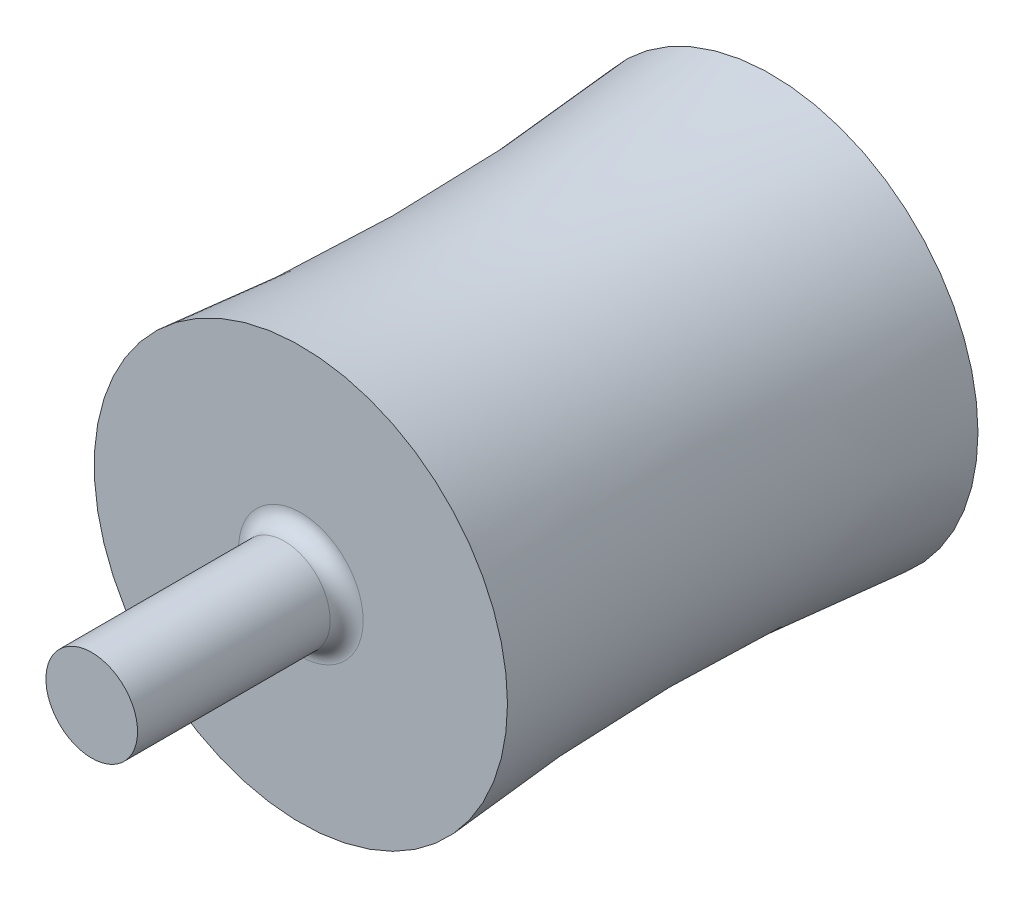
ISO-10303-21;
HEADER;
FILE_DESCRIPTION(('STEP AP214'),'2;1');
FILE_NAME('part.step','',(''),(''),'','','');
FILE_SCHEMA(('AUTOMOTIVE_DESIGN { 1 0 10303 214 1 1 1 1 }'));
ENDSEC;
DATA;
#1=APPLICATION_CONTEXT('core data for automotive mechanical design processes');
#2=APPLICATION_PROTOCOL_DEFINITION('international standard','automotive_design',2000,#1);
#3=PRODUCT_CONTEXT('',#1,'mechanical');
#4=PRODUCT('Part','Part','',(#3));
#5=PRODUCT_RELATED_PRODUCT_CATEGORY('part','',(#4));
#6=PRODUCT_DEFINITION_FORMATION('','',#4);
#7=PRODUCT_DEFINITION_CONTEXT('part definition',#1,'design');
#8=PRODUCT_DEFINITION('design','',#6,#7);
#9=PRODUCT_DEFINITION_SHAPE('','',#8);
#10=(LENGTH_UNIT() NAMED_UNIT(*) SI_UNIT(.MILLI.,.METRE.));
#11=(NAMED_UNIT(*) PLANE_ANGLE_UNIT() SI_UNIT($,.RADIAN.));
#12=(NAMED_UNIT(*) SI_UNIT($,.STERADIAN.) SOLID_ANGLE_UNIT());
#13=UNCERTAINTY_MEASURE_WITH_UNIT(LENGTH_MEASURE(1.E-05),#10,'distance_accuracy_value','');
#14=(GEOMETRIC_REPRESENTATION_CONTEXT(3) GLOBAL_UNCERTAINTY_ASSIGNED_CONTEXT((#13)) GLOBAL_UNIT_ASSIGNED_CONTEXT((#10,
#11,#12)) REPRESENTATION_CONTEXT('',''));
#15=CARTESIAN_POINT('',(0.,0.,0.));
#16=DIRECTION('',(0.,0.,1.));
#17=DIRECTION('',(1.,0.,0.));
#18=AXIS2_PLACEMENT_3D('',#15,#16,#17);
#19=CARTESIAN_POINT('',(0.,0.,57.15));
#20=DIRECTION('',(0.,0.,1.));
#21=DIRECTION('',(1.,0.,0.));
#22=AXIS2_PLACEMENT_3D('',#19,#20,#21);
#23=PLANE('',#22);
#24=CARTESIAN_POINT('',(0.,0.,57.15));
#25=DIRECTION('',(0.,0.,1.));
#26=DIRECTION('',(1.,0.,0.));
#27=AXIS2_PLACEMENT_3D('',#24,#25,#26);
#28=CIRCLE('',#27,7.565233599);
#29=CARTESIAN_POINT('',(7.565233599,0.,57.15));
#30=VERTEX_POINT('',#29);
#31=EDGE_CURVE('E10',#30,#30,#28,.F.);
#32=ORIENTED_EDGE('',*,*,#31,.T.);
#33=EDGE_LOOP('',(#32));
#34=FACE_BOUND('',#33,.T.);
#35=CARTESIAN_POINT('',(0.,0.,57.15));
#36=DIRECTION('',(0.,0.,1.));
#37=DIRECTION('',(1.,0.,0.));
#38=AXIS2_PLACEMENT_3D('',#35,#36,#37);
#39=CIRCLE('',#38,25.099999965);
#40=CARTESIAN_POINT('',(25.099999965,0.,57.15));
#41=VERTEX_POINT('',#40);
#42=EDGE_CURVE('E64',#41,#41,#39,.T.);
#43=ORIENTED_EDGE('',*,*,#42,.T.);
#44=EDGE_LOOP('',(#43));
#45=FACE_BOUND('',#44,.T.);
#46=ADVANCED_FACE('F35',(#34,#45),#23,.T.);
#47=CARTESIAN_POINT('',(0.,0.,82.55));
#48=DIRECTION('',(0.,0.,-1.));
#49=DIRECTION('',(-1.,0.,0.));
#50=AXIS2_PLACEMENT_3D('',#47,#48,#49);
#51=CYLINDRICAL_SURFACE('',#50,5.565233599);
#52=CARTESIAN_POINT('',(0.,0.,59.15));
#53=DIRECTION('',(0.,0.,1.));
#54=DIRECTION('',(1.,0.,0.));
#55=AXIS2_PLACEMENT_3D('',#52,#53,#54);
#56=CIRCLE('',#55,5.565233599);
#57=CARTESIAN_POINT('',(5.565233599,0.,59.15));
#58=VERTEX_POINT('',#57);
#59=EDGE_CURVE('E42',#58,#58,#56,.T.);
#60=ORIENTED_EDGE('',*,*,#59,.T.);
#61=EDGE_LOOP('',(#60));
#62=FACE_BOUND('',#61,.T.);
#63=CARTESIAN_POINT('',(0.,0.,82.55));
#64=DIRECTION('',(0.,0.,1.));
#65=DIRECTION('',(1.,0.,0.));
#66=AXIS2_PLACEMENT_3D('',#63,#64,#65);
#67=CIRCLE('',#66,5.565233599);
#68=CARTESIAN_POINT('',(5.565233599,0.,82.55));
#69=VERTEX_POINT('',#68);
#70=EDGE_CURVE('E58',#69,#69,#67,.T.);
#71=ORIENTED_EDGE('',*,*,#70,.F.);
#72=EDGE_LOOP('',(#71));
#73=FACE_BOUND('',#72,.T.);
#74=ADVANCED_FACE('F85',(#62,#73),#51,.T.);
#75=CARTESIAN_POINT('',(0.,0.,82.55));
#76=DIRECTION('',(0.,0.,1.));
#77=DIRECTION('',(1.,0.,0.));
#78=AXIS2_PLACEMENT_3D('',#75,#76,#77);
#79=PLANE('',#78);
#80=ORIENTED_EDGE('',*,*,#70,.T.);
#81=EDGE_LOOP('',(#80));
#82=FACE_BOUND('',#81,.T.);
#83=ADVANCED_FACE('F81',(#82),#79,.T.);
#84=CARTESIAN_POINT('',(0.,0.,59.15));
#85=DIRECTION('',(0.,0.,1.));
#86=DIRECTION('',(1.,0.,0.));
#87=AXIS2_PLACEMENT_3D('',#84,#85,#86);
#88=TOROIDAL_SURFACE('',#87,7.565233599,2.);
#89=ORIENTED_EDGE('',*,*,#31,.F.);
#90=EDGE_LOOP('',(#89));
#91=FACE_BOUND('',#90,.T.);
#92=ORIENTED_EDGE('',*,*,#59,.F.);
#93=EDGE_LOOP('',(#92));
#94=FACE_BOUND('',#93,.T.);
#95=ADVANCED_FACE('F37',(#91,#94),#88,.F.);
#96=CARTESIAN_POINT('',(0.,0.,28.575));
#97=DIRECTION('',(0.,0.,1.));
#98=DIRECTION('',(1.,0.,0.));
#99=AXIS2_PLACEMENT_3D('',#96,#97,#98);
#100=TOROIDAL_SURFACE('',#99,277.487538038892,254.);
#101=CARTESIAN_POINT('',(0.,0.,0.));
#102=DIRECTION('',(0.,0.,1.));
#103=DIRECTION('',(1.,0.,0.));
#104=AXIS2_PLACEMENT_3D('',#101,#102,#103);
#105=CIRCLE('',#104,25.099999965);
#106=CARTESIAN_POINT('',(25.099999965,0.,0.));
#107=VERTEX_POINT('',#106);
#108=EDGE_CURVE('E61',#107,#107,#105,.T.);
#109=ORIENTED_EDGE('',*,*,#108,.T.);
#110=EDGE_LOOP('',(#109));
#111=FACE_BOUND('',#110,.T.);
#112=ORIENTED_EDGE('',*,*,#42,.F.);
#113=EDGE_LOOP('',(#112));
#114=FACE_BOUND('',#113,.T.);
#115=ADVANCED_FACE('F69',(#111,#114),#100,.F.);
#116=CARTESIAN_POINT('',(0.,0.,53.975));
#117=DIRECTION('',(0.,0.,-1.));
#118=DIRECTION('',(-1.,0.,0.));
#119=AXIS2_PLACEMENT_3D('',#116,#117,#118);
#120=PLANE('',#119);
#121=CARTESIAN_POINT('',(0.,0.,53.975));
#122=DIRECTION('',(0.,0.,-1.));
#123=DIRECTION('',(-1.,0.,0.));
#124=AXIS2_PLACEMENT_3D('',#121,#122,#123);
#125=CIRCLE('',#124,21.25);
#126=CARTESIAN_POINT('',(-21.25,0.,53.975));
#127=VERTEX_POINT('',#126);
#128=EDGE_CURVE('E55',#127,#127,#125,.T.);
#129=ORIENTED_EDGE('',*,*,#128,.T.);
#130=EDGE_LOOP('',(#129));
#131=FACE_BOUND('',#130,.T.);
#132=ADVANCED_FACE('F71',(#131),#120,.T.);
#133=CARTESIAN_POINT('',(0.,0.,53.975));
#134=DIRECTION('',(0.,0.,-1.));
#135=DIRECTION('',(-1.,0.,0.));
#136=AXIS2_PLACEMENT_3D('',#133,#134,#135);
#137=CYLINDRICAL_SURFACE('',#136,21.25);
#138=CARTESIAN_POINT('',(0.,0.,2.));
#139=DIRECTION('',(0.,0.,1.));
#140=DIRECTION('',(1.,0.,0.));
#141=AXIS2_PLACEMENT_3D('',#138,#139,#140);
#142=CIRCLE('',#141,21.25);
#143=CARTESIAN_POINT('',(21.25,0.,2.));
#144=VERTEX_POINT('',#143);
#145=EDGE_CURVE('E50',#144,#144,#142,.F.);
#146=ORIENTED_EDGE('',*,*,#145,.T.);
#147=EDGE_LOOP('',(#146));
#148=FACE_BOUND('',#147,.T.);
#149=ORIENTED_EDGE('',*,*,#128,.F.);
#150=EDGE_LOOP('',(#149));
#151=FACE_BOUND('',#150,.T.);
#152=ADVANCED_FACE('F78',(#148,#151),#137,.F.);
#153=CARTESIAN_POINT('',(0.,0.,2.));
#154=DIRECTION('',(0.,0.,1.));
#155=DIRECTION('',(1.,0.,0.));
#156=AXIS2_PLACEMENT_3D('',#153,#154,#155);
#157=TOROIDAL_SURFACE('',#156,23.25,2.);
#158=CARTESIAN_POINT('',(0.,0.,0.));
#159=DIRECTION('',(0.,0.,1.));
#160=DIRECTION('',(1.,0.,0.));
#161=AXIS2_PLACEMENT_3D('',#158,#159,#160);
#162=CIRCLE('',#161,23.25);
#163=CARTESIAN_POINT('',(23.25,0.,0.));
#164=VERTEX_POINT('',#163);
#165=EDGE_CURVE('E46',#164,#164,#162,.T.);
#166=ORIENTED_EDGE('',*,*,#165,.F.);
#167=EDGE_LOOP('',(#166));
#168=FACE_BOUND('',#167,.T.);
#169=ORIENTED_EDGE('',*,*,#145,.F.);
#170=EDGE_LOOP('',(#169));
#171=FACE_BOUND('',#170,.T.);
#172=ADVANCED_FACE('F95',(#168,#171),#157,.T.);
#173=CARTESIAN_POINT('',(0.,0.,0.));
#174=DIRECTION('',(0.,0.,1.));
#175=DIRECTION('',(1.,0.,0.));
#176=AXIS2_PLACEMENT_3D('',#173,#174,#175);
#177=PLANE('',#176);
#178=ORIENTED_EDGE('',*,*,#165,.T.);
#179=EDGE_LOOP('',(#178));
#180=FACE_BOUND('',#179,.T.);
#181=ORIENTED_EDGE('',*,*,#108,.F.);
#182=EDGE_LOOP('',(#181));
#183=FACE_BOUND('',#182,.T.);
#184=ADVANCED_FACE('F93',(#180,#183),#177,.F.);
#185=CLOSED_SHELL('',(#46,#74,#83,#95,#115,#132,#152,#172,#184));
#186=MANIFOLD_SOLID_BREP('B2',#185);
#187=ADVANCED_BREP_SHAPE_REPRESENTATION('',(#18,#186),#14);
#188=SHAPE_DEFINITION_REPRESENTATION(#9,#187);
ENDSEC;
END-ISO-10303-21;
